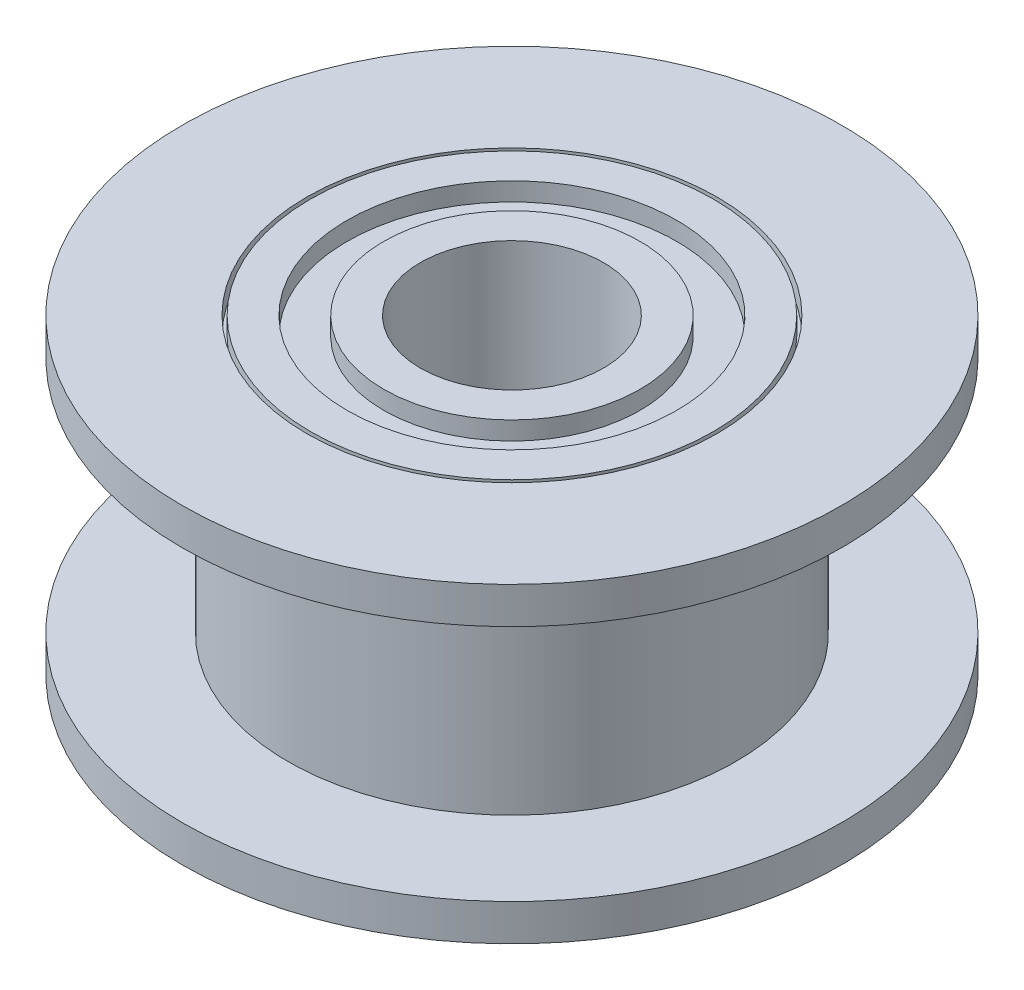
ISO-10303-21;
HEADER;
FILE_DESCRIPTION(('STEP AP214'),'2;1');
FILE_NAME('part.step','',(''),(''),'','','');
FILE_SCHEMA(('AUTOMOTIVE_DESIGN { 1 0 10303 214 1 1 1 1 }'));
ENDSEC;
DATA;
#1=APPLICATION_CONTEXT('core data for automotive mechanical design processes');
#2=APPLICATION_PROTOCOL_DEFINITION('international standard','automotive_design',2000,#1);
#3=PRODUCT_CONTEXT('',#1,'mechanical');
#4=PRODUCT('Part','Part','',(#3));
#5=PRODUCT_RELATED_PRODUCT_CATEGORY('part','',(#4));
#6=PRODUCT_DEFINITION_FORMATION('','',#4);
#7=PRODUCT_DEFINITION_CONTEXT('part definition',#1,'design');
#8=PRODUCT_DEFINITION('design','',#6,#7);
#9=PRODUCT_DEFINITION_SHAPE('','',#8);
#10=(LENGTH_UNIT() NAMED_UNIT(*) SI_UNIT(.MILLI.,.METRE.));
#11=(NAMED_UNIT(*) PLANE_ANGLE_UNIT() SI_UNIT($,.RADIAN.));
#12=(NAMED_UNIT(*) SI_UNIT($,.STERADIAN.) SOLID_ANGLE_UNIT());
#13=UNCERTAINTY_MEASURE_WITH_UNIT(LENGTH_MEASURE(1.E-05),#10,'distance_accuracy_value','');
#14=(GEOMETRIC_REPRESENTATION_CONTEXT(3) GLOBAL_UNCERTAINTY_ASSIGNED_CONTEXT((#13)) GLOBAL_UNIT_ASSIGNED_CONTEXT((#10,
#11,#12)) REPRESENTATION_CONTEXT('',''));
#15=CARTESIAN_POINT('',(0.,0.,0.));
#16=DIRECTION('',(0.,0.,1.));
#17=DIRECTION('',(1.,0.,0.));
#18=AXIS2_PLACEMENT_3D('',#15,#16,#17);
#19=CARTESIAN_POINT('',(0.,0.,0.));
#20=DIRECTION('',(0.,1.,0.));
#21=DIRECTION('',(0.,0.,1.));
#22=AXIS2_PLACEMENT_3D('',#19,#20,#21);
#23=PLANE('',#22);
#24=CARTESIAN_POINT('',(0.,0.,0.));
#25=DIRECTION('',(0.,1.,0.));
#26=DIRECTION('',(0.,0.,1.));
#27=AXIS2_PLACEMENT_3D('',#24,#25,#26);
#28=CIRCLE('',#27,2.5);
#29=CARTESIAN_POINT('',(0.,0.,2.5));
#30=VERTEX_POINT('',#29);
#31=EDGE_CURVE('E78',#30,#30,#28,.T.);
#32=ORIENTED_EDGE('',*,*,#31,.T.);
#33=EDGE_LOOP('',(#32));
#34=FACE_BOUND('',#33,.T.);
#35=CARTESIAN_POINT('',(0.,0.,0.));
#36=DIRECTION('',(0.,1.,0.));
#37=DIRECTION('',(0.,0.,1.));
#38=AXIS2_PLACEMENT_3D('',#35,#36,#37);
#39=CIRCLE('',#38,3.5);
#40=CARTESIAN_POINT('',(0.,0.,3.5));
#41=VERTEX_POINT('',#40);
#42=EDGE_CURVE('E115',#41,#41,#39,.T.);
#43=ORIENTED_EDGE('',*,*,#42,.F.);
#44=EDGE_LOOP('',(#43));
#45=FACE_BOUND('',#44,.T.);
#46=ADVANCED_FACE('F57',(#34,#45),#23,.F.);
#47=CARTESIAN_POINT('',(0.,8.5,0.));
#48=DIRECTION('',(0.,-1.,0.));
#49=DIRECTION('',(0.,0.,1.));
#50=AXIS2_PLACEMENT_3D('',#47,#48,#49);
#51=PLANE('',#50);
#52=CARTESIAN_POINT('',(0.,8.5,0.));
#53=DIRECTION('',(0.,1.,0.));
#54=DIRECTION('',(0.,0.,1.));
#55=AXIS2_PLACEMENT_3D('',#52,#53,#54);
#56=CIRCLE('',#55,2.5);
#57=CARTESIAN_POINT('',(0.,8.5,2.5));
#58=VERTEX_POINT('',#57);
#59=EDGE_CURVE('E81',#58,#58,#56,.T.);
#60=ORIENTED_EDGE('',*,*,#59,.F.);
#61=EDGE_LOOP('',(#60));
#62=FACE_BOUND('',#61,.T.);
#63=CARTESIAN_POINT('',(0.,8.5,0.));
#64=DIRECTION('',(0.,1.,0.));
#65=DIRECTION('',(0.,0.,1.));
#66=AXIS2_PLACEMENT_3D('',#63,#64,#65);
#67=CIRCLE('',#66,3.5);
#68=CARTESIAN_POINT('',(0.,8.5,3.5));
#69=VERTEX_POINT('',#68);
#70=EDGE_CURVE('E91',#69,#69,#67,.T.);
#71=ORIENTED_EDGE('',*,*,#70,.T.);
#72=EDGE_LOOP('',(#71));
#73=FACE_BOUND('',#72,.T.);
#74=ADVANCED_FACE('F157',(#62,#73),#51,.F.);
#75=CARTESIAN_POINT('',(0.,1.,0.));
#76=DIRECTION('',(0.,-1.,0.));
#77=DIRECTION('',(0.,0.,-1.));
#78=AXIS2_PLACEMENT_3D('',#75,#76,#77);
#79=CYLINDRICAL_SURFACE('',#78,9.);
#80=CARTESIAN_POINT('',(0.,1.,0.));
#81=DIRECTION('',(0.,1.,0.));
#82=DIRECTION('',(0.,0.,1.));
#83=AXIS2_PLACEMENT_3D('',#80,#81,#82);
#84=CIRCLE('',#83,9.);
#85=CARTESIAN_POINT('',(0.,1.,9.));
#86=VERTEX_POINT('',#85);
#87=EDGE_CURVE('E65',#86,#86,#84,.T.);
#88=ORIENTED_EDGE('',*,*,#87,.F.);
#89=EDGE_LOOP('',(#88));
#90=FACE_BOUND('',#89,.T.);
#91=CARTESIAN_POINT('',(0.,0.,0.));
#92=DIRECTION('',(0.,1.,0.));
#93=DIRECTION('',(0.,0.,1.));
#94=AXIS2_PLACEMENT_3D('',#91,#92,#93);
#95=CIRCLE('',#94,9.);
#96=CARTESIAN_POINT('',(0.,0.,9.));
#97=VERTEX_POINT('',#96);
#98=EDGE_CURVE('E61',#97,#97,#95,.T.);
#99=ORIENTED_EDGE('',*,*,#98,.T.);
#100=EDGE_LOOP('',(#99));
#101=FACE_BOUND('',#100,.T.);
#102=ADVANCED_FACE('F59',(#90,#101),#79,.T.);
#103=CARTESIAN_POINT('',(0.,1.,0.));
#104=DIRECTION('',(0.,1.,0.));
#105=DIRECTION('',(0.,0.,1.));
#106=AXIS2_PLACEMENT_3D('',#103,#104,#105);
#107=PLANE('',#106);
#108=CARTESIAN_POINT('',(0.,1.,0.));
#109=DIRECTION('',(0.,1.,0.));
#110=DIRECTION('',(0.,0.,1.));
#111=AXIS2_PLACEMENT_3D('',#108,#109,#110);
#112=CIRCLE('',#111,6.1121977);
#113=CARTESIAN_POINT('',(0.,1.,-6.1121977));
#114=VERTEX_POINT('',#113);
#115=EDGE_CURVE('E11',#114,#114,#112,.T.);
#116=ORIENTED_EDGE('',*,*,#115,.F.);
#117=EDGE_LOOP('',(#116));
#118=FACE_BOUND('',#117,.T.);
#119=ORIENTED_EDGE('',*,*,#87,.T.);
#120=EDGE_LOOP('',(#119));
#121=FACE_BOUND('',#120,.T.);
#122=ADVANCED_FACE('F161',(#118,#121),#107,.T.);
#123=CARTESIAN_POINT('',(0.,0.,0.));
#124=DIRECTION('',(0.,1.,0.));
#125=DIRECTION('',(0.,0.,1.));
#126=AXIS2_PLACEMENT_3D('',#123,#124,#125);
#127=CIRCLE('',#126,5.6);
#128=CARTESIAN_POINT('',(0.,0.,5.6));
#129=VERTEX_POINT('',#128);
#130=EDGE_CURVE('E123',#129,#129,#127,.T.);
#131=ORIENTED_EDGE('',*,*,#130,.T.);
#132=EDGE_LOOP('',(#131));
#133=FACE_BOUND('',#132,.T.);
#134=ORIENTED_EDGE('',*,*,#98,.F.);
#135=EDGE_LOOP('',(#134));
#136=FACE_BOUND('',#135,.T.);
#137=ADVANCED_FACE('F149',(#133,#136),#23,.F.);
#138=CARTESIAN_POINT('',(0.,4.25,0.));
#139=DIRECTION('',(0.,-1.,0.));
#140=DIRECTION('',(0.,0.,-1.));
#141=AXIS2_PLACEMENT_3D('',#138,#139,#140);
#142=CYLINDRICAL_SURFACE('',#141,6.1121977);
#143=CARTESIAN_POINT('',(0.,7.5,0.));
#144=DIRECTION('',(0.,1.,0.));
#145=DIRECTION('',(0.,0.,1.));
#146=AXIS2_PLACEMENT_3D('',#143,#144,#145);
#147=CIRCLE('',#146,6.1121977);
#148=CARTESIAN_POINT('',(0.,7.5,-6.1121977));
#149=VERTEX_POINT('',#148);
#150=EDGE_CURVE('E71',#149,#149,#147,.T.);
#151=CARTESIAN_POINT('',(0.,1.,-6.1121977));
#152=CARTESIAN_POINT('',(0.,1.06770833333333,-6.1121977));
#153=CARTESIAN_POINT('',(0.,1.13541666666667,-6.1121977));
#154=CARTESIAN_POINT('',(0.,1.27083333333333,-6.1121977));
#155=CARTESIAN_POINT('',(0.,1.33854166666667,-6.1121977));
#156=CARTESIAN_POINT('',(0.,1.47395833333333,-6.1121977));
#157=CARTESIAN_POINT('',(0.,1.54166666666667,-6.1121977));
#158=CARTESIAN_POINT('',(0.,1.67708333333333,-6.1121977));
#159=CARTESIAN_POINT('',(0.,1.74479166666667,-6.1121977));
#160=CARTESIAN_POINT('',(0.,1.88020833333333,-6.1121977));
#161=CARTESIAN_POINT('',(0.,1.94791666666667,-6.1121977));
#162=CARTESIAN_POINT('',(0.,2.08333333333333,-6.1121977));
#163=CARTESIAN_POINT('',(0.,2.15104166666667,-6.1121977));
#164=CARTESIAN_POINT('',(0.,2.28645833333333,-6.1121977));
#165=CARTESIAN_POINT('',(0.,2.35416666666667,-6.1121977));
#166=CARTESIAN_POINT('',(0.,2.48958333333333,-6.1121977));
#167=CARTESIAN_POINT('',(0.,2.55729166666667,-6.1121977));
#168=CARTESIAN_POINT('',(0.,2.69270833333333,-6.1121977));
#169=CARTESIAN_POINT('',(0.,2.76041666666667,-6.1121977));
#170=CARTESIAN_POINT('',(0.,2.89583333333333,-6.1121977));
#171=CARTESIAN_POINT('',(0.,2.96354166666667,-6.1121977));
#172=CARTESIAN_POINT('',(0.,3.09895833333333,-6.1121977));
#173=CARTESIAN_POINT('',(0.,3.16666666666667,-6.1121977));
#174=CARTESIAN_POINT('',(0.,3.30208333333333,-6.1121977));
#175=CARTESIAN_POINT('',(0.,3.36979166666667,-6.1121977));
#176=CARTESIAN_POINT('',(0.,3.50520833333333,-6.1121977));
#177=CARTESIAN_POINT('',(0.,3.57291666666667,-6.1121977));
#178=CARTESIAN_POINT('',(0.,3.70833333333333,-6.1121977));
#179=CARTESIAN_POINT('',(0.,3.77604166666667,-6.1121977));
#180=CARTESIAN_POINT('',(0.,3.91145833333333,-6.1121977));
#181=CARTESIAN_POINT('',(0.,3.97916666666667,-6.1121977));
#182=CARTESIAN_POINT('',(0.,4.11458333333333,-6.1121977));
#183=CARTESIAN_POINT('',(0.,4.18229166666667,-6.1121977));
#184=CARTESIAN_POINT('',(0.,4.31770833333333,-6.1121977));
#185=CARTESIAN_POINT('',(0.,4.38541666666667,-6.1121977));
#186=CARTESIAN_POINT('',(0.,4.52083333333333,-6.1121977));
#187=CARTESIAN_POINT('',(0.,4.58854166666667,-6.1121977));
#188=CARTESIAN_POINT('',(0.,4.72395833333333,-6.1121977));
#189=CARTESIAN_POINT('',(0.,4.79166666666667,-6.1121977));
#190=CARTESIAN_POINT('',(0.,4.92708333333333,-6.1121977));
#191=CARTESIAN_POINT('',(0.,4.99479166666667,-6.1121977));
#192=CARTESIAN_POINT('',(0.,5.13020833333333,-6.1121977));
#193=CARTESIAN_POINT('',(0.,5.19791666666667,-6.1121977));
#194=CARTESIAN_POINT('',(0.,5.33333333333333,-6.1121977));
#195=CARTESIAN_POINT('',(0.,5.40104166666667,-6.1121977));
#196=CARTESIAN_POINT('',(0.,5.53645833333333,-6.1121977));
#197=CARTESIAN_POINT('',(0.,5.60416666666667,-6.1121977));
#198=CARTESIAN_POINT('',(0.,5.73958333333333,-6.1121977));
#199=CARTESIAN_POINT('',(0.,5.80729166666667,-6.1121977));
#200=CARTESIAN_POINT('',(0.,5.94270833333333,-6.1121977));
#201=CARTESIAN_POINT('',(0.,6.01041666666667,-6.1121977));
#202=CARTESIAN_POINT('',(0.,6.14583333333333,-6.1121977));
#203=CARTESIAN_POINT('',(0.,6.21354166666667,-6.1121977));
#204=CARTESIAN_POINT('',(0.,6.34895833333333,-6.1121977));
#205=CARTESIAN_POINT('',(0.,6.41666666666667,-6.1121977));
#206=CARTESIAN_POINT('',(0.,6.55208333333333,-6.1121977));
#207=CARTESIAN_POINT('',(0.,6.61979166666667,-6.1121977));
#208=CARTESIAN_POINT('',(0.,6.75520833333333,-6.1121977));
#209=CARTESIAN_POINT('',(0.,6.82291666666667,-6.1121977));
#210=CARTESIAN_POINT('',(0.,6.95833333333333,-6.1121977));
#211=CARTESIAN_POINT('',(0.,7.02604166666667,-6.1121977));
#212=CARTESIAN_POINT('',(0.,7.16145833333333,-6.1121977));
#213=CARTESIAN_POINT('',(0.,7.22916666666667,-6.1121977));
#214=CARTESIAN_POINT('',(0.,7.36458333333333,-6.1121977));
#215=CARTESIAN_POINT('',(0.,7.43229166666667,-6.1121977));
#216=CARTESIAN_POINT('',(0.,7.5,-6.1121977));
#217=B_SPLINE_CURVE_WITH_KNOTS('',3,(#151,#152,#153,#154,#155,#156,#157,#158,#159,#160,#161,
#162,#163,#164,#165,#166,#167,#168,#169,#170,#171,#172,#173,#174,#175,#176,#177,#178,#179,#180,
#181,#182,#183,#184,#185,#186,#187,#188,#189,#190,#191,#192,#193,#194,#195,#196,#197,#198,#199,
#200,#201,#202,#203,#204,#205,#206,#207,#208,#209,#210,#211,#212,#213,#214,#215,#216),
.UNSPECIFIED.,.F.,.F.,(4,2,2,2,2,2,2,2,2,2,2,2,2,2,2,2,2,2,2,2,2,2,2,2,2,2,2,2,2,2,2,2,4),(0.,
0.203125,0.40625,0.609375,0.8125,1.015625,1.21875,1.421875,1.625,1.828125,2.03125,2.234375,
2.4375,2.640625,2.84375,3.046875,3.25,3.453125,3.65625,3.859375,4.0625,4.265625,4.46875,
4.671875,4.875,5.078125,5.28125,5.484375,5.6875,5.890625,6.09375,6.296875,6.5),.UNSPECIFIED.);
#218=EDGE_CURVE('BSEAM160',#114,#149,#217,.T.);
#219=ORIENTED_EDGE('',*,*,#115,.T.);
#220=ORIENTED_EDGE('',*,*,#150,.F.);
#221=ORIENTED_EDGE('',*,*,#218,.T.);
#222=ORIENTED_EDGE('',*,*,#218,.F.);
#223=EDGE_LOOP('',(#219,#221,#220,#222));
#224=FACE_BOUND('',#223,.T.);
#225=ADVANCED_FACE('F160',(#224),#142,.T.);
#226=CARTESIAN_POINT('',(0.,7.5,0.));
#227=DIRECTION('',(0.,1.,0.));
#228=DIRECTION('',(0.,0.,1.));
#229=AXIS2_PLACEMENT_3D('',#226,#227,#228);
#230=CYLINDRICAL_SURFACE('',#229,9.);
#231=CARTESIAN_POINT('',(0.,7.5,0.));
#232=DIRECTION('',(0.,1.,0.));
#233=DIRECTION('',(0.,0.,1.));
#234=AXIS2_PLACEMENT_3D('',#231,#232,#233);
#235=CIRCLE('',#234,9.);
#236=CARTESIAN_POINT('',(0.,7.5,9.));
#237=VERTEX_POINT('',#236);
#238=EDGE_CURVE('E74',#237,#237,#235,.T.);
#239=ORIENTED_EDGE('',*,*,#238,.T.);
#240=EDGE_LOOP('',(#239));
#241=FACE_BOUND('',#240,.T.);
#242=CARTESIAN_POINT('',(0.,8.5,0.));
#243=DIRECTION('',(0.,1.,0.));
#244=DIRECTION('',(0.,0.,1.));
#245=AXIS2_PLACEMENT_3D('',#242,#243,#244);
#246=CIRCLE('',#245,9.);
#247=CARTESIAN_POINT('',(0.,8.5,9.));
#248=VERTEX_POINT('',#247);
#249=EDGE_CURVE('E75',#248,#248,#246,.T.);
#250=ORIENTED_EDGE('',*,*,#249,.F.);
#251=EDGE_LOOP('',(#250));
#252=FACE_BOUND('',#251,.T.);
#253=ADVANCED_FACE('F168',(#241,#252),#230,.T.);
#254=CARTESIAN_POINT('',(0.,7.5,0.));
#255=DIRECTION('',(0.,-1.,0.));
#256=DIRECTION('',(0.,0.,1.));
#257=AXIS2_PLACEMENT_3D('',#254,#255,#256);
#258=PLANE('',#257);
#259=ORIENTED_EDGE('',*,*,#150,.T.);
#260=EDGE_LOOP('',(#259));
#261=FACE_BOUND('',#260,.T.);
#262=ORIENTED_EDGE('',*,*,#238,.F.);
#263=EDGE_LOOP('',(#262));
#264=FACE_BOUND('',#263,.T.);
#265=ADVANCED_FACE('F197',(#261,#264),#258,.T.);
#266=CARTESIAN_POINT('',(0.,8.5,0.));
#267=DIRECTION('',(0.,1.,0.));
#268=DIRECTION('',(0.,0.,1.));
#269=AXIS2_PLACEMENT_3D('',#266,#267,#268);
#270=CIRCLE('',#269,5.6);
#271=CARTESIAN_POINT('',(0.,8.5,5.6));
#272=VERTEX_POINT('',#271);
#273=EDGE_CURVE('E99',#272,#272,#270,.T.);
#274=ORIENTED_EDGE('',*,*,#273,.F.);
#275=EDGE_LOOP('',(#274));
#276=FACE_BOUND('',#275,.T.);
#277=ORIENTED_EDGE('',*,*,#249,.T.);
#278=EDGE_LOOP('',(#277));
#279=FACE_BOUND('',#278,.T.);
#280=ADVANCED_FACE('F184',(#276,#279),#51,.F.);
#281=CARTESIAN_POINT('',(0.,0.,0.));
#282=DIRECTION('',(0.,1.,0.));
#283=DIRECTION('',(0.,0.,1.));
#284=AXIS2_PLACEMENT_3D('',#281,#282,#283);
#285=CYLINDRICAL_SURFACE('',#284,2.5);
#286=ORIENTED_EDGE('',*,*,#31,.F.);
#287=EDGE_LOOP('',(#286));
#288=FACE_BOUND('',#287,.T.);
#289=ORIENTED_EDGE('',*,*,#59,.T.);
#290=EDGE_LOOP('',(#289));
#291=FACE_BOUND('',#290,.T.);
#292=ADVANCED_FACE('F196',(#288,#291),#285,.F.);
#293=CARTESIAN_POINT('',(0.,8.,0.));
#294=DIRECTION('',(0.,1.,0.));
#295=DIRECTION('',(0.,0.,1.));
#296=AXIS2_PLACEMENT_3D('',#293,#294,#295);
#297=CYLINDRICAL_SURFACE('',#296,3.5);
#298=CARTESIAN_POINT('',(0.,8.,0.));
#299=DIRECTION('',(0.,1.,0.));
#300=DIRECTION('',(0.,0.,1.));
#301=AXIS2_PLACEMENT_3D('',#298,#299,#300);
#302=CIRCLE('',#301,3.5);
#303=CARTESIAN_POINT('',(0.,8.,3.5));
#304=VERTEX_POINT('',#303);
#305=EDGE_CURVE('E90',#304,#304,#302,.T.);
#306=ORIENTED_EDGE('',*,*,#305,.T.);
#307=EDGE_LOOP('',(#306));
#308=FACE_BOUND('',#307,.T.);
#309=ORIENTED_EDGE('',*,*,#70,.F.);
#310=EDGE_LOOP('',(#309));
#311=FACE_BOUND('',#310,.T.);
#312=ADVANCED_FACE('F234',(#308,#311),#297,.T.);
#313=CARTESIAN_POINT('',(0.,8.,0.));
#314=DIRECTION('',(0.,1.,0.));
#315=DIRECTION('',(0.,0.,1.));
#316=AXIS2_PLACEMENT_3D('',#313,#314,#315);
#317=CYLINDRICAL_SURFACE('',#316,4.5);
#318=CARTESIAN_POINT('',(0.,8.,0.));
#319=DIRECTION('',(0.,1.,0.));
#320=DIRECTION('',(0.,0.,1.));
#321=AXIS2_PLACEMENT_3D('',#318,#319,#320);
#322=CIRCLE('',#321,4.5);
#323=CARTESIAN_POINT('',(0.,8.,4.5));
#324=VERTEX_POINT('',#323);
#325=EDGE_CURVE('E84',#324,#324,#322,.T.);
#326=ORIENTED_EDGE('',*,*,#325,.F.);
#327=EDGE_LOOP('',(#326));
#328=FACE_BOUND('',#327,.T.);
#329=CARTESIAN_POINT('',(0.,8.5,0.));
#330=DIRECTION('',(0.,1.,0.));
#331=DIRECTION('',(0.,0.,1.));
#332=AXIS2_PLACEMENT_3D('',#329,#330,#331);
#333=CIRCLE('',#332,4.5);
#334=CARTESIAN_POINT('',(0.,8.5,4.5));
#335=VERTEX_POINT('',#334);
#336=EDGE_CURVE('E87',#335,#335,#333,.T.);
#337=ORIENTED_EDGE('',*,*,#336,.T.);
#338=EDGE_LOOP('',(#337));
#339=FACE_BOUND('',#338,.T.);
#340=ADVANCED_FACE('F228',(#328,#339),#317,.F.);
#341=CARTESIAN_POINT('',(0.,8.,0.));
#342=DIRECTION('',(0.,1.,0.));
#343=DIRECTION('',(0.,0.,1.));
#344=AXIS2_PLACEMENT_3D('',#341,#342,#343);
#345=PLANE('',#344);
#346=ORIENTED_EDGE('',*,*,#305,.F.);
#347=EDGE_LOOP('',(#346));
#348=FACE_BOUND('',#347,.T.);
#349=ORIENTED_EDGE('',*,*,#325,.T.);
#350=EDGE_LOOP('',(#349));
#351=FACE_BOUND('',#350,.T.);
#352=ADVANCED_FACE('F219',(#348,#351),#345,.T.);
#353=CARTESIAN_POINT('',(0.,8.,0.));
#354=DIRECTION('',(0.,1.,0.));
#355=DIRECTION('',(0.,0.,1.));
#356=AXIS2_PLACEMENT_3D('',#353,#354,#355);
#357=CYLINDRICAL_SURFACE('',#356,5.5);
#358=CARTESIAN_POINT('',(0.,8.,0.));
#359=DIRECTION('',(0.,1.,0.));
#360=DIRECTION('',(0.,0.,1.));
#361=AXIS2_PLACEMENT_3D('',#358,#359,#360);
#362=CIRCLE('',#361,5.5);
#363=CARTESIAN_POINT('',(0.,8.,5.5));
#364=VERTEX_POINT('',#363);
#365=EDGE_CURVE('E102',#364,#364,#362,.T.);
#366=ORIENTED_EDGE('',*,*,#365,.T.);
#367=EDGE_LOOP('',(#366));
#368=FACE_BOUND('',#367,.T.);
#369=CARTESIAN_POINT('',(0.,8.5,0.));
#370=DIRECTION('',(0.,1.,0.));
#371=DIRECTION('',(0.,0.,1.));
#372=AXIS2_PLACEMENT_3D('',#369,#370,#371);
#373=CIRCLE('',#372,5.5);
#374=CARTESIAN_POINT('',(0.,8.5,5.5));
#375=VERTEX_POINT('',#374);
#376=EDGE_CURVE('E103',#375,#375,#373,.T.);
#377=ORIENTED_EDGE('',*,*,#376,.F.);
#378=EDGE_LOOP('',(#377));
#379=FACE_BOUND('',#378,.T.);
#380=ADVANCED_FACE('F217',(#368,#379),#357,.T.);
#381=CARTESIAN_POINT('',(0.,8.,0.));
#382=DIRECTION('',(0.,1.,0.));
#383=DIRECTION('',(0.,0.,1.));
#384=AXIS2_PLACEMENT_3D('',#381,#382,#383);
#385=CYLINDRICAL_SURFACE('',#384,5.6);
#386=CARTESIAN_POINT('',(0.,8.,0.));
#387=DIRECTION('',(0.,1.,0.));
#388=DIRECTION('',(0.,0.,1.));
#389=AXIS2_PLACEMENT_3D('',#386,#387,#388);
#390=CIRCLE('',#389,5.6);
#391=CARTESIAN_POINT('',(0.,8.,5.6));
#392=VERTEX_POINT('',#391);
#393=EDGE_CURVE('E94',#392,#392,#390,.T.);
#394=ORIENTED_EDGE('',*,*,#393,.F.);
#395=EDGE_LOOP('',(#394));
#396=FACE_BOUND('',#395,.T.);
#397=ORIENTED_EDGE('',*,*,#273,.T.);
#398=EDGE_LOOP('',(#397));
#399=FACE_BOUND('',#398,.T.);
#400=ADVANCED_FACE('F210',(#396,#399),#385,.F.);
#401=CARTESIAN_POINT('',(0.,8.,0.));
#402=DIRECTION('',(0.,1.,0.));
#403=DIRECTION('',(0.,0.,1.));
#404=AXIS2_PLACEMENT_3D('',#401,#402,#403);
#405=PLANE('',#404);
#406=ORIENTED_EDGE('',*,*,#365,.F.);
#407=EDGE_LOOP('',(#406));
#408=FACE_BOUND('',#407,.T.);
#409=ORIENTED_EDGE('',*,*,#393,.T.);
#410=EDGE_LOOP('',(#409));
#411=FACE_BOUND('',#410,.T.);
#412=ADVANCED_FACE('F201',(#408,#411),#405,.T.);
#413=ORIENTED_EDGE('',*,*,#336,.F.);
#414=EDGE_LOOP('',(#413));
#415=FACE_BOUND('',#414,.T.);
#416=ORIENTED_EDGE('',*,*,#376,.T.);
#417=EDGE_LOOP('',(#416));
#418=FACE_BOUND('',#417,.T.);
#419=ADVANCED_FACE('F185',(#415,#418),#51,.F.);
#420=CARTESIAN_POINT('',(0.,0.5,0.));
#421=DIRECTION('',(0.,-1.,0.));
#422=DIRECTION('',(0.,0.,-1.));
#423=AXIS2_PLACEMENT_3D('',#420,#421,#422);
#424=CYLINDRICAL_SURFACE('',#423,3.5);
#425=CARTESIAN_POINT('',(0.,0.5,0.));
#426=DIRECTION('',(0.,1.,0.));
#427=DIRECTION('',(0.,0.,1.));
#428=AXIS2_PLACEMENT_3D('',#425,#426,#427);
#429=CIRCLE('',#428,3.5);
#430=CARTESIAN_POINT('',(0.,0.5,3.5));
#431=VERTEX_POINT('',#430);
#432=EDGE_CURVE('E114',#431,#431,#429,.T.);
#433=ORIENTED_EDGE('',*,*,#432,.F.);
#434=EDGE_LOOP('',(#433));
#435=FACE_BOUND('',#434,.T.);
#436=ORIENTED_EDGE('',*,*,#42,.T.);
#437=EDGE_LOOP('',(#436));
#438=FACE_BOUND('',#437,.T.);
#439=ADVANCED_FACE('F200',(#435,#438),#424,.T.);
#440=CARTESIAN_POINT('',(0.,0.5,0.));
#441=DIRECTION('',(0.,-1.,0.));
#442=DIRECTION('',(0.,0.,-1.));
#443=AXIS2_PLACEMENT_3D('',#440,#441,#442);
#444=CYLINDRICAL_SURFACE('',#443,4.5);
#445=CARTESIAN_POINT('',(0.,0.5,0.));
#446=DIRECTION('',(0.,1.,0.));
#447=DIRECTION('',(0.,0.,1.));
#448=AXIS2_PLACEMENT_3D('',#445,#446,#447);
#449=CIRCLE('',#448,4.5);
#450=CARTESIAN_POINT('',(0.,0.5,4.5));
#451=VERTEX_POINT('',#450);
#452=EDGE_CURVE('E106',#451,#451,#449,.T.);
#453=ORIENTED_EDGE('',*,*,#452,.T.);
#454=EDGE_LOOP('',(#453));
#455=FACE_BOUND('',#454,.T.);
#456=CARTESIAN_POINT('',(0.,0.,0.));
#457=DIRECTION('',(0.,1.,0.));
#458=DIRECTION('',(0.,0.,1.));
#459=AXIS2_PLACEMENT_3D('',#456,#457,#458);
#460=CIRCLE('',#459,4.5);
#461=CARTESIAN_POINT('',(0.,0.,4.5));
#462=VERTEX_POINT('',#461);
#463=EDGE_CURVE('E111',#462,#462,#460,.T.);
#464=ORIENTED_EDGE('',*,*,#463,.F.);
#465=EDGE_LOOP('',(#464));
#466=FACE_BOUND('',#465,.T.);
#467=ADVANCED_FACE('F206',(#455,#466),#444,.F.);
#468=CARTESIAN_POINT('',(0.,0.5,0.));
#469=DIRECTION('',(0.,-1.,0.));
#470=DIRECTION('',(0.,0.,1.));
#471=AXIS2_PLACEMENT_3D('',#468,#469,#470);
#472=PLANE('',#471);
#473=ORIENTED_EDGE('',*,*,#432,.T.);
#474=EDGE_LOOP('',(#473));
#475=FACE_BOUND('',#474,.T.);
#476=ORIENTED_EDGE('',*,*,#452,.F.);
#477=EDGE_LOOP('',(#476));
#478=FACE_BOUND('',#477,.T.);
#479=ADVANCED_FACE('F142',(#475,#478),#472,.T.);
#480=CARTESIAN_POINT('',(0.,0.5,0.));
#481=DIRECTION('',(0.,-1.,0.));
#482=DIRECTION('',(0.,0.,-1.));
#483=AXIS2_PLACEMENT_3D('',#480,#481,#482);
#484=CYLINDRICAL_SURFACE('',#483,5.5);
#485=CARTESIAN_POINT('',(0.,0.5,0.));
#486=DIRECTION('',(0.,1.,0.));
#487=DIRECTION('',(0.,0.,1.));
#488=AXIS2_PLACEMENT_3D('',#485,#486,#487);
#489=CIRCLE('',#488,5.5);
#490=CARTESIAN_POINT('',(0.,0.5,5.5));
#491=VERTEX_POINT('',#490);
#492=EDGE_CURVE('E126',#491,#491,#489,.T.);
#493=ORIENTED_EDGE('',*,*,#492,.F.);
#494=EDGE_LOOP('',(#493));
#495=FACE_BOUND('',#494,.T.);
#496=CARTESIAN_POINT('',(0.,0.,0.));
#497=DIRECTION('',(0.,1.,0.));
#498=DIRECTION('',(0.,0.,1.));
#499=AXIS2_PLACEMENT_3D('',#496,#497,#498);
#500=CIRCLE('',#499,5.5);
#501=CARTESIAN_POINT('',(0.,0.,5.5));
#502=VERTEX_POINT('',#501);
#503=EDGE_CURVE('E127',#502,#502,#500,.T.);
#504=ORIENTED_EDGE('',*,*,#503,.T.);
#505=EDGE_LOOP('',(#504));
#506=FACE_BOUND('',#505,.T.);
#507=ADVANCED_FACE('F138',(#495,#506),#484,.T.);
#508=CARTESIAN_POINT('',(0.,0.5,0.));
#509=DIRECTION('',(0.,-1.,0.));
#510=DIRECTION('',(0.,0.,-1.));
#511=AXIS2_PLACEMENT_3D('',#508,#509,#510);
#512=CYLINDRICAL_SURFACE('',#511,5.6);
#513=CARTESIAN_POINT('',(0.,0.5,0.));
#514=DIRECTION('',(0.,1.,0.));
#515=DIRECTION('',(0.,0.,1.));
#516=AXIS2_PLACEMENT_3D('',#513,#514,#515);
#517=CIRCLE('',#516,5.6);
#518=CARTESIAN_POINT('',(0.,0.5,5.6));
#519=VERTEX_POINT('',#518);
#520=EDGE_CURVE('E118',#519,#519,#517,.T.);
#521=ORIENTED_EDGE('',*,*,#520,.T.);
#522=EDGE_LOOP('',(#521));
#523=FACE_BOUND('',#522,.T.);
#524=ORIENTED_EDGE('',*,*,#130,.F.);
#525=EDGE_LOOP('',(#524));
#526=FACE_BOUND('',#525,.T.);
#527=ADVANCED_FACE('F141',(#523,#526),#512,.F.);
#528=CARTESIAN_POINT('',(0.,0.5,0.));
#529=DIRECTION('',(0.,-1.,0.));
#530=DIRECTION('',(0.,0.,1.));
#531=AXIS2_PLACEMENT_3D('',#528,#529,#530);
#532=PLANE('',#531);
#533=ORIENTED_EDGE('',*,*,#492,.T.);
#534=EDGE_LOOP('',(#533));
#535=FACE_BOUND('',#534,.T.);
#536=ORIENTED_EDGE('',*,*,#520,.F.);
#537=EDGE_LOOP('',(#536));
#538=FACE_BOUND('',#537,.T.);
#539=ADVANCED_FACE('F135',(#535,#538),#532,.T.);
#540=ORIENTED_EDGE('',*,*,#463,.T.);
#541=EDGE_LOOP('',(#540));
#542=FACE_BOUND('',#541,.T.);
#543=ORIENTED_EDGE('',*,*,#503,.F.);
#544=EDGE_LOOP('',(#543));
#545=FACE_BOUND('',#544,.T.);
#546=ADVANCED_FACE('F146',(#542,#545),#23,.F.);
#547=CLOSED_SHELL('',(#46,#74,#102,#122,#137,#225,#253,#265,#280,#292,#312,#340,#352,#380,#400,
#412,#419,#439,#467,#479,#507,#527,#539,#546));
#548=MANIFOLD_SOLID_BREP('B2',#547);
#549=ADVANCED_BREP_SHAPE_REPRESENTATION('',(#18,#548),#14);
#550=SHAPE_DEFINITION_REPRESENTATION(#9,#549);
ENDSEC;
END-ISO-10303-21;
